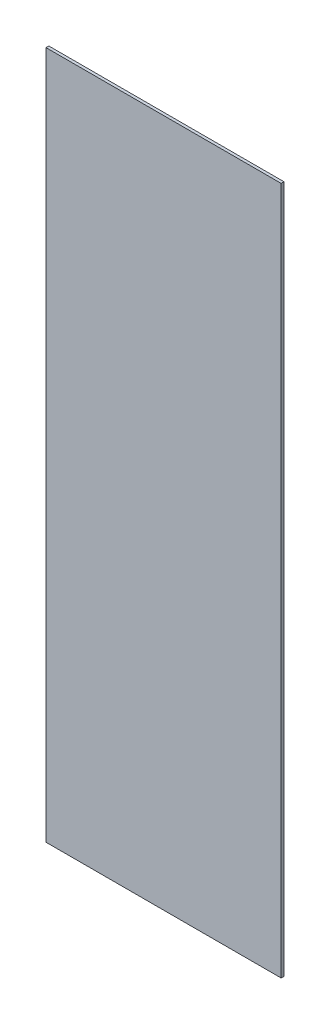
ISO-10303-21;
HEADER;
FILE_DESCRIPTION(('STEP AP214'),'2;1');
FILE_NAME('part.step','',(''),(''),'','','');
FILE_SCHEMA(('AUTOMOTIVE_DESIGN { 1 0 10303 214 1 1 1 1 }'));
ENDSEC;
DATA;
#1=APPLICATION_CONTEXT('core data for automotive mechanical design processes');
#2=APPLICATION_PROTOCOL_DEFINITION('international standard','automotive_design',2000,#1);
#3=PRODUCT_CONTEXT('',#1,'mechanical');
#4=PRODUCT('Part','Part','',(#3));
#5=PRODUCT_RELATED_PRODUCT_CATEGORY('part','',(#4));
#6=PRODUCT_DEFINITION_FORMATION('','',#4);
#7=PRODUCT_DEFINITION_CONTEXT('part definition',#1,'design');
#8=PRODUCT_DEFINITION('design','',#6,#7);
#9=PRODUCT_DEFINITION_SHAPE('','',#8);
#10=(LENGTH_UNIT() NAMED_UNIT(*) SI_UNIT(.MILLI.,.METRE.));
#11=(NAMED_UNIT(*) PLANE_ANGLE_UNIT() SI_UNIT($,.RADIAN.));
#12=(NAMED_UNIT(*) SI_UNIT($,.STERADIAN.) SOLID_ANGLE_UNIT());
#13=UNCERTAINTY_MEASURE_WITH_UNIT(LENGTH_MEASURE(1.E-05),#10,'distance_accuracy_value','');
#14=(GEOMETRIC_REPRESENTATION_CONTEXT(3) GLOBAL_UNCERTAINTY_ASSIGNED_CONTEXT((#13)) GLOBAL_UNIT_ASSIGNED_CONTEXT((#10,
#11,#12)) REPRESENTATION_CONTEXT('',''));
#15=CARTESIAN_POINT('',(0.,0.,0.));
#16=DIRECTION('',(0.,0.,1.));
#17=DIRECTION('',(1.,0.,0.));
#18=AXIS2_PLACEMENT_3D('',#15,#16,#17);
#19=CARTESIAN_POINT('',(0.,0.,1.));
#20=DIRECTION('',(1.,0.,0.));
#21=DIRECTION('',(0.,0.,-1.));
#22=AXIS2_PLACEMENT_3D('',#19,#20,#21);
#23=PLANE('',#22);
#24=DIRECTION('',(0.,-1.,0.));
#25=VECTOR('',#24,1.);
#26=CARTESIAN_POINT('',(0.,0.,0.));
#27=LINE('',#26,#25);
#28=CARTESIAN_POINT('',(0.,243.,0.));
#29=VERTEX_POINT('',#28);
#30=CARTESIAN_POINT('',(0.,0.,0.));
#31=VERTEX_POINT('',#30);
#32=EDGE_CURVE('E104',#29,#31,#27,.T.);
#33=ORIENTED_EDGE('',*,*,#32,.T.);
#34=DIRECTION('',(0.,0.,-1.));
#35=VECTOR('',#34,1.);
#36=CARTESIAN_POINT('',(0.,0.,1.));
#37=LINE('',#36,#35);
#38=CARTESIAN_POINT('',(0.,0.,1.));
#39=VERTEX_POINT('',#38);
#40=EDGE_CURVE('E11',#39,#31,#37,.T.);
#41=ORIENTED_EDGE('',*,*,#40,.F.);
#42=DIRECTION('',(0.,-1.,0.));
#43=VECTOR('',#42,1.);
#44=CARTESIAN_POINT('',(0.,0.,1.));
#45=LINE('',#44,#43);
#46=CARTESIAN_POINT('',(0.,243.,1.));
#47=VERTEX_POINT('',#46);
#48=EDGE_CURVE('E92',#47,#39,#45,.T.);
#49=ORIENTED_EDGE('',*,*,#48,.F.);
#50=DIRECTION('',(0.,0.,-1.));
#51=VECTOR('',#50,1.);
#52=CARTESIAN_POINT('',(0.,243.,1.));
#53=LINE('',#52,#51);
#54=EDGE_CURVE('E100',#47,#29,#53,.T.);
#55=ORIENTED_EDGE('',*,*,#54,.T.);
#56=EDGE_LOOP('',(#33,#41,#49,#55));
#57=FACE_BOUND('',#56,.T.);
#58=ADVANCED_FACE('F41',(#57),#23,.F.);
#59=CARTESIAN_POINT('',(0.,0.,1.));
#60=DIRECTION('',(0.,1.,0.));
#61=DIRECTION('',(0.,0.,1.));
#62=AXIS2_PLACEMENT_3D('',#59,#60,#61);
#63=PLANE('',#62);
#64=DIRECTION('',(1.,0.,0.));
#65=VECTOR('',#64,1.);
#66=CARTESIAN_POINT('',(0.,0.,0.));
#67=LINE('',#66,#65);
#68=CARTESIAN_POINT('',(83.,0.,0.));
#69=VERTEX_POINT('',#68);
#70=EDGE_CURVE('E96',#31,#69,#67,.T.);
#71=ORIENTED_EDGE('',*,*,#70,.T.);
#72=DIRECTION('',(0.,0.,-1.));
#73=VECTOR('',#72,1.);
#74=CARTESIAN_POINT('',(83.,0.,1.));
#75=LINE('',#74,#73);
#76=CARTESIAN_POINT('',(83.,0.,1.));
#77=VERTEX_POINT('',#76);
#78=EDGE_CURVE('E49',#77,#69,#75,.T.);
#79=ORIENTED_EDGE('',*,*,#78,.F.);
#80=DIRECTION('',(1.,0.,0.));
#81=VECTOR('',#80,1.);
#82=CARTESIAN_POINT('',(0.,0.,1.));
#83=LINE('',#82,#81);
#84=EDGE_CURVE('E87',#39,#77,#83,.T.);
#85=ORIENTED_EDGE('',*,*,#84,.F.);
#86=ORIENTED_EDGE('',*,*,#40,.T.);
#87=EDGE_LOOP('',(#71,#79,#85,#86));
#88=FACE_BOUND('',#87,.T.);
#89=ADVANCED_FACE('F95',(#88),#63,.F.);
#90=CARTESIAN_POINT('',(83.,0.,1.));
#91=DIRECTION('',(-1.,0.,0.));
#92=DIRECTION('',(0.,0.,1.));
#93=AXIS2_PLACEMENT_3D('',#90,#91,#92);
#94=PLANE('',#93);
#95=DIRECTION('',(0.,1.,0.));
#96=VECTOR('',#95,1.);
#97=CARTESIAN_POINT('',(83.,0.,0.));
#98=LINE('',#97,#96);
#99=CARTESIAN_POINT('',(83.,243.,0.));
#100=VERTEX_POINT('',#99);
#101=EDGE_CURVE('E74',#69,#100,#98,.T.);
#102=ORIENTED_EDGE('',*,*,#101,.T.);
#103=DIRECTION('',(0.,0.,-1.));
#104=VECTOR('',#103,1.);
#105=CARTESIAN_POINT('',(83.,243.,1.));
#106=LINE('',#105,#104);
#107=CARTESIAN_POINT('',(83.,243.,1.));
#108=VERTEX_POINT('',#107);
#109=EDGE_CURVE('E97',#108,#100,#106,.T.);
#110=ORIENTED_EDGE('',*,*,#109,.F.);
#111=DIRECTION('',(0.,1.,0.));
#112=VECTOR('',#111,1.);
#113=CARTESIAN_POINT('',(83.,0.,1.));
#114=LINE('',#113,#112);
#115=EDGE_CURVE('E90',#77,#108,#114,.T.);
#116=ORIENTED_EDGE('',*,*,#115,.F.);
#117=ORIENTED_EDGE('',*,*,#78,.T.);
#118=EDGE_LOOP('',(#102,#110,#116,#117));
#119=FACE_BOUND('',#118,.T.);
#120=ADVANCED_FACE('F98',(#119),#94,.F.);
#121=CARTESIAN_POINT('',(0.,243.,1.));
#122=DIRECTION('',(0.,-1.,0.));
#123=DIRECTION('',(0.,0.,-1.));
#124=AXIS2_PLACEMENT_3D('',#121,#122,#123);
#125=PLANE('',#124);
#126=DIRECTION('',(-1.,0.,0.));
#127=VECTOR('',#126,1.);
#128=CARTESIAN_POINT('',(0.,243.,0.));
#129=LINE('',#128,#127);
#130=EDGE_CURVE('E80',#100,#29,#129,.T.);
#131=ORIENTED_EDGE('',*,*,#130,.T.);
#132=ORIENTED_EDGE('',*,*,#54,.F.);
#133=DIRECTION('',(-1.,0.,0.));
#134=VECTOR('',#133,1.);
#135=CARTESIAN_POINT('',(0.,243.,1.));
#136=LINE('',#135,#134);
#137=EDGE_CURVE('E57',#108,#47,#136,.T.);
#138=ORIENTED_EDGE('',*,*,#137,.F.);
#139=ORIENTED_EDGE('',*,*,#109,.T.);
#140=EDGE_LOOP('',(#131,#132,#138,#139));
#141=FACE_BOUND('',#140,.T.);
#142=ADVANCED_FACE('F111',(#141),#125,.F.);
#143=CARTESIAN_POINT('',(0.,0.,1.));
#144=DIRECTION('',(0.,0.,-1.));
#145=DIRECTION('',(-1.,0.,0.));
#146=AXIS2_PLACEMENT_3D('',#143,#144,#145);
#147=PLANE('',#146);
#148=ORIENTED_EDGE('',*,*,#48,.T.);
#149=ORIENTED_EDGE('',*,*,#84,.T.);
#150=ORIENTED_EDGE('',*,*,#115,.T.);
#151=ORIENTED_EDGE('',*,*,#137,.T.);
#152=EDGE_LOOP('',(#148,#149,#150,#151));
#153=FACE_BOUND('',#152,.T.);
#154=ADVANCED_FACE('F88',(#153),#147,.F.);
#155=CARTESIAN_POINT('',(0.,0.,0.));
#156=DIRECTION('',(0.,0.,-1.));
#157=DIRECTION('',(-1.,0.,0.));
#158=AXIS2_PLACEMENT_3D('',#155,#156,#157);
#159=PLANE('',#158);
#160=ORIENTED_EDGE('',*,*,#32,.F.);
#161=ORIENTED_EDGE('',*,*,#130,.F.);
#162=ORIENTED_EDGE('',*,*,#101,.F.);
#163=ORIENTED_EDGE('',*,*,#70,.F.);
#164=EDGE_LOOP('',(#160,#161,#162,#163));
#165=FACE_BOUND('',#164,.T.);
#166=ADVANCED_FACE('F114',(#165),#159,.T.);
#167=CLOSED_SHELL('',(#58,#89,#120,#142,#154,#166));
#168=MANIFOLD_SOLID_BREP('B2',#167);
#169=ADVANCED_BREP_SHAPE_REPRESENTATION('',(#18,#168),#14);
#170=SHAPE_DEFINITION_REPRESENTATION(#9,#169);
ENDSEC;
END-ISO-10303-21;
